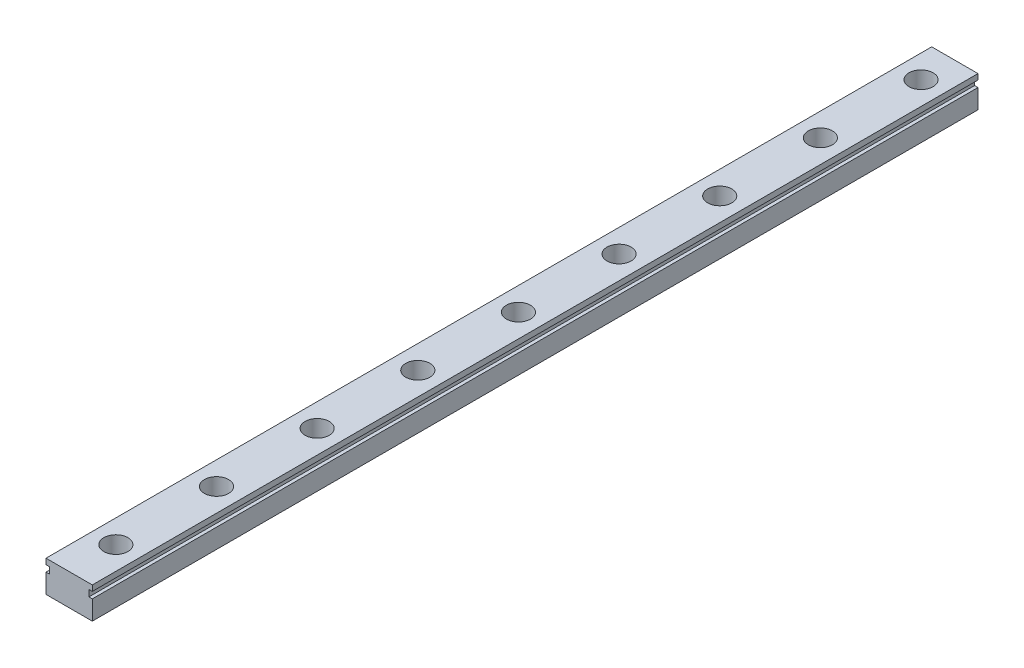
ISO-10303-21;
HEADER;
FILE_DESCRIPTION(('STEP AP214'),'2;1');
FILE_NAME('part.step','',(''),(''),'','','');
FILE_SCHEMA(('AUTOMOTIVE_DESIGN { 1 0 10303 214 1 1 1 1 }'));
ENDSEC;
DATA;
#1=APPLICATION_CONTEXT('core data for automotive mechanical design processes');
#2=APPLICATION_PROTOCOL_DEFINITION('international standard','automotive_design',2000,#1);
#3=PRODUCT_CONTEXT('',#1,'mechanical');
#4=PRODUCT('Part','Part','',(#3));
#5=PRODUCT_RELATED_PRODUCT_CATEGORY('part','',(#4));
#6=PRODUCT_DEFINITION_FORMATION('','',#4);
#7=PRODUCT_DEFINITION_CONTEXT('part definition',#1,'design');
#8=PRODUCT_DEFINITION('design','',#6,#7);
#9=PRODUCT_DEFINITION_SHAPE('','',#8);
#10=(LENGTH_UNIT() NAMED_UNIT(*) SI_UNIT(.MILLI.,.METRE.));
#11=(NAMED_UNIT(*) PLANE_ANGLE_UNIT() SI_UNIT($,.RADIAN.));
#12=(NAMED_UNIT(*) SI_UNIT($,.STERADIAN.) SOLID_ANGLE_UNIT());
#13=UNCERTAINTY_MEASURE_WITH_UNIT(LENGTH_MEASURE(1.E-05),#10,'distance_accuracy_value','');
#14=(GEOMETRIC_REPRESENTATION_CONTEXT(3) GLOBAL_UNCERTAINTY_ASSIGNED_CONTEXT((#13)) GLOBAL_UNIT_ASSIGNED_CONTEXT((#10,
#11,#12)) REPRESENTATION_CONTEXT('',''));
#15=CARTESIAN_POINT('',(0.,0.,0.));
#16=DIRECTION('',(0.,0.,1.));
#17=DIRECTION('',(1.,0.,0.));
#18=AXIS2_PLACEMENT_3D('',#15,#16,#17);
#19=CARTESIAN_POINT('',(5.75,-3.9,220.));
#20=DIRECTION('',(-1.,0.,0.));
#21=DIRECTION('',(0.,0.,1.));
#22=AXIS2_PLACEMENT_3D('',#19,#20,#21);
#23=PLANE('',#22);
#24=DIRECTION('',(0.,1.,0.));
#25=VECTOR('',#24,1.);
#26=CARTESIAN_POINT('',(5.75,-3.9,0.));
#27=LINE('',#26,#25);
#28=CARTESIAN_POINT('',(5.75,-3.9,0.));
#29=VERTEX_POINT('',#28);
#30=CARTESIAN_POINT('',(5.75,0.900000000000001,0.));
#31=VERTEX_POINT('',#30);
#32=EDGE_CURVE('E148',#29,#31,#27,.T.);
#33=ORIENTED_EDGE('',*,*,#32,.T.);
#34=DIRECTION('',(0.,0.,1.));
#35=VECTOR('',#34,1.);
#36=CARTESIAN_POINT('',(5.75,0.900000000000001,0.));
#37=LINE('',#36,#35);
#38=CARTESIAN_POINT('',(5.75,0.900000000000001,220.));
#39=VERTEX_POINT('',#38);
#40=EDGE_CURVE('E149',#31,#39,#37,.T.);
#41=ORIENTED_EDGE('',*,*,#40,.T.);
#42=DIRECTION('',(0.,1.,0.));
#43=VECTOR('',#42,1.);
#44=CARTESIAN_POINT('',(5.75,-3.9,220.));
#45=LINE('',#44,#43);
#46=CARTESIAN_POINT('',(5.75,-3.9,220.));
#47=VERTEX_POINT('',#46);
#48=EDGE_CURVE('E198',#47,#39,#45,.T.);
#49=ORIENTED_EDGE('',*,*,#48,.F.);
#50=DIRECTION('',(0.,0.,-1.));
#51=VECTOR('',#50,1.);
#52=CARTESIAN_POINT('',(5.75,-3.9,220.));
#53=LINE('',#52,#51);
#54=EDGE_CURVE('E166',#47,#29,#53,.T.);
#55=ORIENTED_EDGE('',*,*,#54,.T.);
#56=EDGE_LOOP('',(#33,#41,#49,#55));
#57=FACE_BOUND('',#56,.T.);
#58=ADVANCED_FACE('F37',(#57),#23,.F.);
#59=CARTESIAN_POINT('',(-5.75,-3.9,220.));
#60=DIRECTION('',(1.,0.,0.));
#61=DIRECTION('',(0.,0.,-1.));
#62=AXIS2_PLACEMENT_3D('',#59,#60,#61);
#63=PLANE('',#62);
#64=DIRECTION('',(0.,-1.,0.));
#65=VECTOR('',#64,1.);
#66=CARTESIAN_POINT('',(-5.75,-3.9,0.));
#67=LINE('',#66,#65);
#68=CARTESIAN_POINT('',(-5.75,3.9,0.));
#69=VERTEX_POINT('',#68);
#70=CARTESIAN_POINT('',(-5.75,2.5,0.));
#71=VERTEX_POINT('',#70);
#72=EDGE_CURVE('E161',#69,#71,#67,.T.);
#73=ORIENTED_EDGE('',*,*,#72,.T.);
#74=DIRECTION('',(0.,0.,1.));
#75=VECTOR('',#74,1.);
#76=CARTESIAN_POINT('',(-5.75,2.5,0.));
#77=LINE('',#76,#75);
#78=CARTESIAN_POINT('',(-5.75,2.5,220.));
#79=VERTEX_POINT('',#78);
#80=EDGE_CURVE('E238',#71,#79,#77,.T.);
#81=ORIENTED_EDGE('',*,*,#80,.T.);
#82=DIRECTION('',(0.,-1.,0.));
#83=VECTOR('',#82,1.);
#84=CARTESIAN_POINT('',(-5.75,-3.9,220.));
#85=LINE('',#84,#83);
#86=CARTESIAN_POINT('',(-5.75,3.9,220.));
#87=VERTEX_POINT('',#86);
#88=EDGE_CURVE('E178',#87,#79,#85,.T.);
#89=ORIENTED_EDGE('',*,*,#88,.F.);
#90=DIRECTION('',(0.,0.,-1.));
#91=VECTOR('',#90,1.);
#92=CARTESIAN_POINT('',(-5.75,3.9,220.));
#93=LINE('',#92,#91);
#94=EDGE_CURVE('E45',#87,#69,#93,.T.);
#95=ORIENTED_EDGE('',*,*,#94,.T.);
#96=EDGE_LOOP('',(#73,#81,#89,#95));
#97=FACE_BOUND('',#96,.T.);
#98=ADVANCED_FACE('F175',(#97),#63,.F.);
#99=CARTESIAN_POINT('',(5.75,2.5,220.));
#100=VERTEX_POINT('',#99);
#101=CARTESIAN_POINT('',(5.75,3.9,220.));
#102=VERTEX_POINT('',#101);
#103=EDGE_CURVE('E141',#100,#102,#45,.T.);
#104=ORIENTED_EDGE('',*,*,#103,.F.);
#105=DIRECTION('',(0.,0.,1.));
#106=VECTOR('',#105,1.);
#107=CARTESIAN_POINT('',(5.75,2.5,0.));
#108=LINE('',#107,#106);
#109=CARTESIAN_POINT('',(5.75,2.5,0.));
#110=VERTEX_POINT('',#109);
#111=EDGE_CURVE('E129',#110,#100,#108,.T.);
#112=ORIENTED_EDGE('',*,*,#111,.F.);
#113=CARTESIAN_POINT('',(5.75,3.9,0.));
#114=VERTEX_POINT('',#113);
#115=EDGE_CURVE('E139',#110,#114,#27,.T.);
#116=ORIENTED_EDGE('',*,*,#115,.T.);
#117=DIRECTION('',(0.,0.,-1.));
#118=VECTOR('',#117,1.);
#119=CARTESIAN_POINT('',(5.75,3.9,220.));
#120=LINE('',#119,#118);
#121=EDGE_CURVE('E11',#102,#114,#120,.T.);
#122=ORIENTED_EDGE('',*,*,#121,.F.);
#123=EDGE_LOOP('',(#104,#112,#116,#122));
#124=FACE_BOUND('',#123,.T.);
#125=ADVANCED_FACE('F39',(#124),#23,.F.);
#126=CARTESIAN_POINT('',(-5.75,3.9,220.));
#127=DIRECTION('',(0.,-1.,0.));
#128=DIRECTION('',(0.,0.,-1.));
#129=AXIS2_PLACEMENT_3D('',#126,#127,#128);
#130=PLANE('',#129);
#131=CARTESIAN_POINT('',(0.,3.9,208.4));
#132=DIRECTION('',(0.,1.,0.));
#133=DIRECTION('',(0.,0.,1.));
#134=AXIS2_PLACEMENT_3D('',#131,#132,#133);
#135=CIRCLE('',#134,3.);
#136=CARTESIAN_POINT('',(0.,3.9,211.4));
#137=VERTEX_POINT('',#136);
#138=EDGE_CURVE('E296',#137,#137,#135,.T.);
#139=ORIENTED_EDGE('',*,*,#138,.F.);
#140=EDGE_LOOP('',(#139));
#141=FACE_BOUND('',#140,.T.);
#142=CARTESIAN_POINT('',(0.,3.9,183.4));
#143=DIRECTION('',(0.,1.,0.));
#144=DIRECTION('',(0.,0.,1.));
#145=AXIS2_PLACEMENT_3D('',#142,#143,#144);
#146=CIRCLE('',#145,3.);
#147=CARTESIAN_POINT('',(0.,3.9,186.4));
#148=VERTEX_POINT('',#147);
#149=EDGE_CURVE('E293',#148,#148,#146,.T.);
#150=ORIENTED_EDGE('',*,*,#149,.F.);
#151=EDGE_LOOP('',(#150));
#152=FACE_BOUND('',#151,.T.);
#153=CARTESIAN_POINT('',(0.,3.9,158.4));
#154=DIRECTION('',(0.,1.,0.));
#155=DIRECTION('',(0.,0.,1.));
#156=AXIS2_PLACEMENT_3D('',#153,#154,#155);
#157=CIRCLE('',#156,3.);
#158=CARTESIAN_POINT('',(0.,3.9,161.4));
#159=VERTEX_POINT('',#158);
#160=EDGE_CURVE('E287',#159,#159,#157,.T.);
#161=ORIENTED_EDGE('',*,*,#160,.F.);
#162=EDGE_LOOP('',(#161));
#163=FACE_BOUND('',#162,.T.);
#164=CARTESIAN_POINT('',(0.,3.9,133.4));
#165=DIRECTION('',(0.,1.,0.));
#166=DIRECTION('',(0.,0.,1.));
#167=AXIS2_PLACEMENT_3D('',#164,#165,#166);
#168=CIRCLE('',#167,3.);
#169=CARTESIAN_POINT('',(0.,3.9,136.4));
#170=VERTEX_POINT('',#169);
#171=EDGE_CURVE('E281',#170,#170,#168,.T.);
#172=ORIENTED_EDGE('',*,*,#171,.F.);
#173=EDGE_LOOP('',(#172));
#174=FACE_BOUND('',#173,.T.);
#175=CARTESIAN_POINT('',(0.,3.9,108.4));
#176=DIRECTION('',(0.,1.,0.));
#177=DIRECTION('',(0.,0.,1.));
#178=AXIS2_PLACEMENT_3D('',#175,#176,#177);
#179=CIRCLE('',#178,3.);
#180=CARTESIAN_POINT('',(0.,3.9,111.4));
#181=VERTEX_POINT('',#180);
#182=EDGE_CURVE('E275',#181,#181,#179,.T.);
#183=ORIENTED_EDGE('',*,*,#182,.F.);
#184=EDGE_LOOP('',(#183));
#185=FACE_BOUND('',#184,.T.);
#186=CARTESIAN_POINT('',(0.,3.9,83.4));
#187=DIRECTION('',(0.,1.,0.));
#188=DIRECTION('',(0.,0.,1.));
#189=AXIS2_PLACEMENT_3D('',#186,#187,#188);
#190=CIRCLE('',#189,3.);
#191=CARTESIAN_POINT('',(0.,3.9,86.4));
#192=VERTEX_POINT('',#191);
#193=EDGE_CURVE('E269',#192,#192,#190,.T.);
#194=ORIENTED_EDGE('',*,*,#193,.F.);
#195=EDGE_LOOP('',(#194));
#196=FACE_BOUND('',#195,.T.);
#197=CARTESIAN_POINT('',(0.,3.9,58.4000000000001));
#198=DIRECTION('',(0.,1.,0.));
#199=DIRECTION('',(0.,0.,1.));
#200=AXIS2_PLACEMENT_3D('',#197,#198,#199);
#201=CIRCLE('',#200,3.);
#202=CARTESIAN_POINT('',(0.,3.9,61.4000000000001));
#203=VERTEX_POINT('',#202);
#204=EDGE_CURVE('E263',#203,#203,#201,.T.);
#205=ORIENTED_EDGE('',*,*,#204,.F.);
#206=EDGE_LOOP('',(#205));
#207=FACE_BOUND('',#206,.T.);
#208=CARTESIAN_POINT('',(0.,3.9,33.4000000000001));
#209=DIRECTION('',(0.,1.,0.));
#210=DIRECTION('',(0.,0.,1.));
#211=AXIS2_PLACEMENT_3D('',#208,#209,#210);
#212=CIRCLE('',#211,3.);
#213=CARTESIAN_POINT('',(0.,3.9,36.4000000000001));
#214=VERTEX_POINT('',#213);
#215=EDGE_CURVE('E257',#214,#214,#212,.T.);
#216=ORIENTED_EDGE('',*,*,#215,.F.);
#217=EDGE_LOOP('',(#216));
#218=FACE_BOUND('',#217,.T.);
#219=CARTESIAN_POINT('',(0.,3.9,8.40000000000007));
#220=DIRECTION('',(0.,1.,0.));
#221=DIRECTION('',(0.,0.,1.));
#222=AXIS2_PLACEMENT_3D('',#219,#220,#221);
#223=CIRCLE('',#222,3.);
#224=CARTESIAN_POINT('',(0.,3.9,11.4000000000001));
#225=VERTEX_POINT('',#224);
#226=EDGE_CURVE('E250',#225,#225,#223,.T.);
#227=ORIENTED_EDGE('',*,*,#226,.F.);
#228=EDGE_LOOP('',(#227));
#229=FACE_BOUND('',#228,.T.);
#230=DIRECTION('',(-1.,0.,0.));
#231=VECTOR('',#230,1.);
#232=CARTESIAN_POINT('',(-5.75,3.9,0.));
#233=LINE('',#232,#231);
#234=EDGE_CURVE('E147',#114,#69,#233,.T.);
#235=ORIENTED_EDGE('',*,*,#234,.T.);
#236=ORIENTED_EDGE('',*,*,#94,.F.);
#237=DIRECTION('',(-1.,0.,0.));
#238=VECTOR('',#237,1.);
#239=CARTESIAN_POINT('',(-5.75,3.9,220.));
#240=LINE('',#239,#238);
#241=EDGE_CURVE('E201',#102,#87,#240,.T.);
#242=ORIENTED_EDGE('',*,*,#241,.F.);
#243=ORIENTED_EDGE('',*,*,#121,.T.);
#244=EDGE_LOOP('',(#235,#236,#242,#243));
#245=FACE_BOUND('',#244,.T.);
#246=ADVANCED_FACE('F378',(#141,#152,#163,#174,#185,#196,#207,#218,#229,#245),#130,.F.);
#247=CARTESIAN_POINT('',(-5.75,0.900000000000001,220.));
#248=VERTEX_POINT('',#247);
#249=CARTESIAN_POINT('',(-5.75,-3.9,220.));
#250=VERTEX_POINT('',#249);
#251=EDGE_CURVE('E202',#248,#250,#85,.T.);
#252=ORIENTED_EDGE('',*,*,#251,.F.);
#253=DIRECTION('',(0.,0.,1.));
#254=VECTOR('',#253,1.);
#255=CARTESIAN_POINT('',(-5.75,0.900000000000001,0.));
#256=LINE('',#255,#254);
#257=CARTESIAN_POINT('',(-5.75,0.900000000000001,0.));
#258=VERTEX_POINT('',#257);
#259=EDGE_CURVE('E186',#258,#248,#256,.T.);
#260=ORIENTED_EDGE('',*,*,#259,.F.);
#261=CARTESIAN_POINT('',(-5.75,-3.9,0.));
#262=VERTEX_POINT('',#261);
#263=EDGE_CURVE('E160',#258,#262,#67,.T.);
#264=ORIENTED_EDGE('',*,*,#263,.T.);
#265=DIRECTION('',(0.,0.,-1.));
#266=VECTOR('',#265,1.);
#267=CARTESIAN_POINT('',(-5.75,-3.9,220.));
#268=LINE('',#267,#266);
#269=EDGE_CURVE('E169',#250,#262,#268,.T.);
#270=ORIENTED_EDGE('',*,*,#269,.F.);
#271=EDGE_LOOP('',(#252,#260,#264,#270));
#272=FACE_BOUND('',#271,.T.);
#273=ADVANCED_FACE('F215',(#272),#63,.F.);
#274=CARTESIAN_POINT('',(-5.75,-3.9,220.));
#275=DIRECTION('',(0.,1.,0.));
#276=DIRECTION('',(0.,0.,1.));
#277=AXIS2_PLACEMENT_3D('',#274,#275,#276);
#278=PLANE('',#277);
#279=CARTESIAN_POINT('',(0.,-3.9,208.4));
#280=DIRECTION('',(0.,1.,0.));
#281=DIRECTION('',(0.,0.,1.));
#282=AXIS2_PLACEMENT_3D('',#279,#280,#281);
#283=CIRCLE('',#282,1.7);
#284=CARTESIAN_POINT('',(0.,-3.9,210.1));
#285=VERTEX_POINT('',#284);
#286=EDGE_CURVE('E251',#285,#285,#283,.T.);
#287=ORIENTED_EDGE('',*,*,#286,.T.);
#288=EDGE_LOOP('',(#287));
#289=FACE_BOUND('',#288,.T.);
#290=CARTESIAN_POINT('',(0.,-3.9,183.4));
#291=DIRECTION('',(0.,1.,0.));
#292=DIRECTION('',(0.,0.,1.));
#293=AXIS2_PLACEMENT_3D('',#290,#291,#292);
#294=CIRCLE('',#293,1.7);
#295=CARTESIAN_POINT('',(0.,-3.9,185.1));
#296=VERTEX_POINT('',#295);
#297=EDGE_CURVE('E343',#296,#296,#294,.T.);
#298=ORIENTED_EDGE('',*,*,#297,.T.);
#299=EDGE_LOOP('',(#298));
#300=FACE_BOUND('',#299,.T.);
#301=CARTESIAN_POINT('',(0.,-3.9,158.4));
#302=DIRECTION('',(0.,1.,0.));
#303=DIRECTION('',(0.,0.,1.));
#304=AXIS2_PLACEMENT_3D('',#301,#302,#303);
#305=CIRCLE('',#304,1.7);
#306=CARTESIAN_POINT('',(0.,-3.9,160.1));
#307=VERTEX_POINT('',#306);
#308=EDGE_CURVE('E337',#307,#307,#305,.T.);
#309=ORIENTED_EDGE('',*,*,#308,.T.);
#310=EDGE_LOOP('',(#309));
#311=FACE_BOUND('',#310,.T.);
#312=CARTESIAN_POINT('',(0.,-3.9,133.4));
#313=DIRECTION('',(0.,1.,0.));
#314=DIRECTION('',(0.,0.,1.));
#315=AXIS2_PLACEMENT_3D('',#312,#313,#314);
#316=CIRCLE('',#315,1.70000000000001);
#317=CARTESIAN_POINT('',(0.,-3.9,135.1));
#318=VERTEX_POINT('',#317);
#319=EDGE_CURVE('E331',#318,#318,#316,.T.);
#320=ORIENTED_EDGE('',*,*,#319,.T.);
#321=EDGE_LOOP('',(#320));
#322=FACE_BOUND('',#321,.T.);
#323=CARTESIAN_POINT('',(0.,-3.9,108.4));
#324=DIRECTION('',(0.,1.,0.));
#325=DIRECTION('',(0.,0.,1.));
#326=AXIS2_PLACEMENT_3D('',#323,#324,#325);
#327=CIRCLE('',#326,1.70000000000001);
#328=CARTESIAN_POINT('',(0.,-3.9,110.1));
#329=VERTEX_POINT('',#328);
#330=EDGE_CURVE('E325',#329,#329,#327,.T.);
#331=ORIENTED_EDGE('',*,*,#330,.T.);
#332=EDGE_LOOP('',(#331));
#333=FACE_BOUND('',#332,.T.);
#334=CARTESIAN_POINT('',(0.,-3.9,83.4));
#335=DIRECTION('',(0.,1.,0.));
#336=DIRECTION('',(0.,0.,1.));
#337=AXIS2_PLACEMENT_3D('',#334,#335,#336);
#338=CIRCLE('',#337,1.70000000000001);
#339=CARTESIAN_POINT('',(0.,-3.9,85.1));
#340=VERTEX_POINT('',#339);
#341=EDGE_CURVE('E319',#340,#340,#338,.T.);
#342=ORIENTED_EDGE('',*,*,#341,.T.);
#343=EDGE_LOOP('',(#342));
#344=FACE_BOUND('',#343,.T.);
#345=CARTESIAN_POINT('',(0.,-3.9,58.4));
#346=DIRECTION('',(0.,1.,0.));
#347=DIRECTION('',(0.,0.,1.));
#348=AXIS2_PLACEMENT_3D('',#345,#346,#347);
#349=CIRCLE('',#348,1.7);
#350=CARTESIAN_POINT('',(0.,-3.9,60.1));
#351=VERTEX_POINT('',#350);
#352=EDGE_CURVE('E313',#351,#351,#349,.T.);
#353=ORIENTED_EDGE('',*,*,#352,.T.);
#354=EDGE_LOOP('',(#353));
#355=FACE_BOUND('',#354,.T.);
#356=CARTESIAN_POINT('',(0.,-3.9,33.4));
#357=DIRECTION('',(0.,1.,0.));
#358=DIRECTION('',(0.,0.,1.));
#359=AXIS2_PLACEMENT_3D('',#356,#357,#358);
#360=CIRCLE('',#359,1.7);
#361=CARTESIAN_POINT('',(0.,-3.9,35.1));
#362=VERTEX_POINT('',#361);
#363=EDGE_CURVE('E307',#362,#362,#360,.T.);
#364=ORIENTED_EDGE('',*,*,#363,.T.);
#365=EDGE_LOOP('',(#364));
#366=FACE_BOUND('',#365,.T.);
#367=CARTESIAN_POINT('',(0.,-3.9,8.40000000000005));
#368=DIRECTION('',(0.,1.,0.));
#369=DIRECTION('',(0.,0.,1.));
#370=AXIS2_PLACEMENT_3D('',#367,#368,#369);
#371=CIRCLE('',#370,1.7);
#372=CARTESIAN_POINT('',(0.,-3.9,10.1));
#373=VERTEX_POINT('',#372);
#374=EDGE_CURVE('E301',#373,#373,#371,.T.);
#375=ORIENTED_EDGE('',*,*,#374,.T.);
#376=EDGE_LOOP('',(#375));
#377=FACE_BOUND('',#376,.T.);
#378=DIRECTION('',(1.,0.,0.));
#379=VECTOR('',#378,1.);
#380=CARTESIAN_POINT('',(-5.75,-3.9,0.));
#381=LINE('',#380,#379);
#382=EDGE_CURVE('E164',#262,#29,#381,.T.);
#383=ORIENTED_EDGE('',*,*,#382,.T.);
#384=ORIENTED_EDGE('',*,*,#54,.F.);
#385=DIRECTION('',(1.,0.,0.));
#386=VECTOR('',#385,1.);
#387=CARTESIAN_POINT('',(-5.75,-3.9,220.));
#388=LINE('',#387,#386);
#389=EDGE_CURVE('E157',#250,#47,#388,.T.);
#390=ORIENTED_EDGE('',*,*,#389,.F.);
#391=ORIENTED_EDGE('',*,*,#269,.T.);
#392=EDGE_LOOP('',(#383,#384,#390,#391));
#393=FACE_BOUND('',#392,.T.);
#394=ADVANCED_FACE('F219',(#289,#300,#311,#322,#333,#344,#355,#366,#377,#393),#278,.F.);
#395=CARTESIAN_POINT('',(0.,0.,220.));
#396=DIRECTION('',(0.,0.,-1.));
#397=DIRECTION('',(-1.,0.,0.));
#398=AXIS2_PLACEMENT_3D('',#395,#396,#397);
#399=PLANE('',#398);
#400=ORIENTED_EDGE('',*,*,#48,.T.);
#401=DIRECTION('',(1.,0.,0.));
#402=VECTOR('',#401,1.);
#403=CARTESIAN_POINT('',(5.75,0.900000000000001,220.));
#404=LINE('',#403,#402);
#405=CARTESIAN_POINT('',(4.91474977144023,0.900000000000001,220.));
#406=VERTEX_POINT('',#405);
#407=EDGE_CURVE('E134',#406,#39,#404,.T.);
#408=ORIENTED_EDGE('',*,*,#407,.F.);
#409=DIRECTION('',(0.,-1.,0.));
#410=VECTOR('',#409,1.);
#411=CARTESIAN_POINT('',(4.91474977144023,2.5,220.));
#412=LINE('',#411,#410);
#413=CARTESIAN_POINT('',(4.91474977144023,2.5,220.));
#414=VERTEX_POINT('',#413);
#415=EDGE_CURVE('E226',#414,#406,#412,.T.);
#416=ORIENTED_EDGE('',*,*,#415,.F.);
#417=DIRECTION('',(-1.,0.,0.));
#418=VECTOR('',#417,1.);
#419=CARTESIAN_POINT('',(5.75,2.5,220.));
#420=LINE('',#419,#418);
#421=EDGE_CURVE('E229',#100,#414,#420,.T.);
#422=ORIENTED_EDGE('',*,*,#421,.F.);
#423=ORIENTED_EDGE('',*,*,#103,.T.);
#424=ORIENTED_EDGE('',*,*,#241,.T.);
#425=ORIENTED_EDGE('',*,*,#88,.T.);
#426=DIRECTION('',(-1.,0.,0.));
#427=VECTOR('',#426,1.);
#428=CARTESIAN_POINT('',(-5.75,2.5,220.));
#429=LINE('',#428,#427);
#430=CARTESIAN_POINT('',(-4.91474977144023,2.5,220.));
#431=VERTEX_POINT('',#430);
#432=EDGE_CURVE('E197',#431,#79,#429,.T.);
#433=ORIENTED_EDGE('',*,*,#432,.F.);
#434=DIRECTION('',(0.,1.,0.));
#435=VECTOR('',#434,1.);
#436=CARTESIAN_POINT('',(-4.91474977144023,2.5,220.));
#437=LINE('',#436,#435);
#438=CARTESIAN_POINT('',(-4.91474977144023,0.900000000000001,220.));
#439=VERTEX_POINT('',#438);
#440=EDGE_CURVE('E241',#439,#431,#437,.T.);
#441=ORIENTED_EDGE('',*,*,#440,.F.);
#442=DIRECTION('',(1.,0.,0.));
#443=VECTOR('',#442,1.);
#444=CARTESIAN_POINT('',(-5.75,0.900000000000001,220.));
#445=LINE('',#444,#443);
#446=EDGE_CURVE('E193',#248,#439,#445,.T.);
#447=ORIENTED_EDGE('',*,*,#446,.F.);
#448=ORIENTED_EDGE('',*,*,#251,.T.);
#449=ORIENTED_EDGE('',*,*,#389,.T.);
#450=EDGE_LOOP('',(#400,#408,#416,#422,#423,#424,#425,#433,#441,#447,#448,#449));
#451=FACE_BOUND('',#450,.T.);
#452=ADVANCED_FACE('F208',(#451),#399,.F.);
#453=CARTESIAN_POINT('',(0.,0.,0.));
#454=DIRECTION('',(0.,0.,-1.));
#455=DIRECTION('',(-1.,0.,0.));
#456=AXIS2_PLACEMENT_3D('',#453,#454,#455);
#457=PLANE('',#456);
#458=DIRECTION('',(1.,0.,0.));
#459=VECTOR('',#458,1.);
#460=CARTESIAN_POINT('',(5.75,0.900000000000001,0.));
#461=LINE('',#460,#459);
#462=CARTESIAN_POINT('',(4.91474977144023,0.900000000000001,0.));
#463=VERTEX_POINT('',#462);
#464=EDGE_CURVE('E142',#463,#31,#461,.T.);
#465=ORIENTED_EDGE('',*,*,#464,.T.);
#466=ORIENTED_EDGE('',*,*,#32,.F.);
#467=ORIENTED_EDGE('',*,*,#382,.F.);
#468=ORIENTED_EDGE('',*,*,#263,.F.);
#469=DIRECTION('',(1.,0.,0.));
#470=VECTOR('',#469,1.);
#471=CARTESIAN_POINT('',(-5.75,0.900000000000001,0.));
#472=LINE('',#471,#470);
#473=CARTESIAN_POINT('',(-4.91474977144023,0.900000000000001,0.));
#474=VERTEX_POINT('',#473);
#475=EDGE_CURVE('E188',#258,#474,#472,.T.);
#476=ORIENTED_EDGE('',*,*,#475,.T.);
#477=DIRECTION('',(0.,1.,0.));
#478=VECTOR('',#477,1.);
#479=CARTESIAN_POINT('',(-4.91474977144023,2.5,0.));
#480=LINE('',#479,#478);
#481=CARTESIAN_POINT('',(-4.91474977144023,2.5,0.));
#482=VERTEX_POINT('',#481);
#483=EDGE_CURVE('E60',#474,#482,#480,.T.);
#484=ORIENTED_EDGE('',*,*,#483,.T.);
#485=DIRECTION('',(-1.,0.,0.));
#486=VECTOR('',#485,1.);
#487=CARTESIAN_POINT('',(-5.75,2.5,0.));
#488=LINE('',#487,#486);
#489=EDGE_CURVE('E183',#482,#71,#488,.T.);
#490=ORIENTED_EDGE('',*,*,#489,.T.);
#491=ORIENTED_EDGE('',*,*,#72,.F.);
#492=ORIENTED_EDGE('',*,*,#234,.F.);
#493=ORIENTED_EDGE('',*,*,#115,.F.);
#494=DIRECTION('',(-1.,0.,0.));
#495=VECTOR('',#494,1.);
#496=CARTESIAN_POINT('',(5.75,2.5,0.));
#497=LINE('',#496,#495);
#498=CARTESIAN_POINT('',(4.91474977144023,2.5,0.));
#499=VERTEX_POINT('',#498);
#500=EDGE_CURVE('E125',#110,#499,#497,.T.);
#501=ORIENTED_EDGE('',*,*,#500,.T.);
#502=DIRECTION('',(0.,-1.,0.));
#503=VECTOR('',#502,1.);
#504=CARTESIAN_POINT('',(4.91474977144023,2.5,0.));
#505=LINE('',#504,#503);
#506=EDGE_CURVE('E52',#499,#463,#505,.T.);
#507=ORIENTED_EDGE('',*,*,#506,.T.);
#508=EDGE_LOOP('',(#465,#466,#467,#468,#476,#484,#490,#491,#492,#493,#501,#507));
#509=FACE_BOUND('',#508,.T.);
#510=ADVANCED_FACE('F145',(#509),#457,.T.);
#511=CARTESIAN_POINT('',(-5.75,2.5,0.));
#512=DIRECTION('',(0.,1.,0.));
#513=DIRECTION('',(0.,0.,1.));
#514=AXIS2_PLACEMENT_3D('',#511,#512,#513);
#515=PLANE('',#514);
#516=ORIENTED_EDGE('',*,*,#432,.T.);
#517=ORIENTED_EDGE('',*,*,#80,.F.);
#518=ORIENTED_EDGE('',*,*,#489,.F.);
#519=DIRECTION('',(0.,0.,1.));
#520=VECTOR('',#519,1.);
#521=CARTESIAN_POINT('',(-4.91474977144023,2.5,0.));
#522=LINE('',#521,#520);
#523=EDGE_CURVE('E236',#482,#431,#522,.T.);
#524=ORIENTED_EDGE('',*,*,#523,.T.);
#525=EDGE_LOOP('',(#516,#517,#518,#524));
#526=FACE_BOUND('',#525,.T.);
#527=ADVANCED_FACE('F453',(#526),#515,.F.);
#528=CARTESIAN_POINT('',(-4.91474977144023,2.5,0.));
#529=DIRECTION('',(1.,0.,0.));
#530=DIRECTION('',(0.,0.,-1.));
#531=AXIS2_PLACEMENT_3D('',#528,#529,#530);
#532=PLANE('',#531);
#533=ORIENTED_EDGE('',*,*,#440,.T.);
#534=ORIENTED_EDGE('',*,*,#523,.F.);
#535=ORIENTED_EDGE('',*,*,#483,.F.);
#536=DIRECTION('',(0.,0.,1.));
#537=VECTOR('',#536,1.);
#538=CARTESIAN_POINT('',(-4.91474977144023,0.900000000000001,0.));
#539=LINE('',#538,#537);
#540=EDGE_CURVE('E190',#474,#439,#539,.T.);
#541=ORIENTED_EDGE('',*,*,#540,.T.);
#542=EDGE_LOOP('',(#533,#534,#535,#541));
#543=FACE_BOUND('',#542,.T.);
#544=ADVANCED_FACE('F460',(#543),#532,.F.);
#545=CARTESIAN_POINT('',(-5.75,0.900000000000001,0.));
#546=DIRECTION('',(0.,-1.,0.));
#547=DIRECTION('',(0.,0.,-1.));
#548=AXIS2_PLACEMENT_3D('',#545,#546,#547);
#549=PLANE('',#548);
#550=ORIENTED_EDGE('',*,*,#446,.T.);
#551=ORIENTED_EDGE('',*,*,#540,.F.);
#552=ORIENTED_EDGE('',*,*,#475,.F.);
#553=ORIENTED_EDGE('',*,*,#259,.T.);
#554=EDGE_LOOP('',(#550,#551,#552,#553));
#555=FACE_BOUND('',#554,.T.);
#556=ADVANCED_FACE('F467',(#555),#549,.F.);
#557=CARTESIAN_POINT('',(5.75,0.900000000000001,0.));
#558=DIRECTION('',(0.,-1.,0.));
#559=DIRECTION('',(0.,0.,-1.));
#560=AXIS2_PLACEMENT_3D('',#557,#558,#559);
#561=PLANE('',#560);
#562=ORIENTED_EDGE('',*,*,#407,.T.);
#563=ORIENTED_EDGE('',*,*,#40,.F.);
#564=ORIENTED_EDGE('',*,*,#464,.F.);
#565=DIRECTION('',(0.,0.,1.));
#566=VECTOR('',#565,1.);
#567=CARTESIAN_POINT('',(4.91474977144023,0.900000000000001,0.));
#568=LINE('',#567,#566);
#569=EDGE_CURVE('E153',#463,#406,#568,.T.);
#570=ORIENTED_EDGE('',*,*,#569,.T.);
#571=EDGE_LOOP('',(#562,#563,#564,#570));
#572=FACE_BOUND('',#571,.T.);
#573=ADVANCED_FACE('F474',(#572),#561,.F.);
#574=CARTESIAN_POINT('',(4.91474977144023,2.5,0.));
#575=DIRECTION('',(-1.,0.,0.));
#576=DIRECTION('',(0.,0.,1.));
#577=AXIS2_PLACEMENT_3D('',#574,#575,#576);
#578=PLANE('',#577);
#579=ORIENTED_EDGE('',*,*,#415,.T.);
#580=ORIENTED_EDGE('',*,*,#569,.F.);
#581=ORIENTED_EDGE('',*,*,#506,.F.);
#582=DIRECTION('',(0.,0.,1.));
#583=VECTOR('',#582,1.);
#584=CARTESIAN_POINT('',(4.91474977144023,2.5,0.));
#585=LINE('',#584,#583);
#586=EDGE_CURVE('E131',#499,#414,#585,.T.);
#587=ORIENTED_EDGE('',*,*,#586,.T.);
#588=EDGE_LOOP('',(#579,#580,#581,#587));
#589=FACE_BOUND('',#588,.T.);
#590=ADVANCED_FACE('F409',(#589),#578,.F.);
#591=CARTESIAN_POINT('',(5.75,2.5,0.));
#592=DIRECTION('',(0.,1.,0.));
#593=DIRECTION('',(0.,0.,1.));
#594=AXIS2_PLACEMENT_3D('',#591,#592,#593);
#595=PLANE('',#594);
#596=ORIENTED_EDGE('',*,*,#421,.T.);
#597=ORIENTED_EDGE('',*,*,#586,.F.);
#598=ORIENTED_EDGE('',*,*,#500,.F.);
#599=ORIENTED_EDGE('',*,*,#111,.T.);
#600=EDGE_LOOP('',(#596,#597,#598,#599));
#601=FACE_BOUND('',#600,.T.);
#602=ADVANCED_FACE('F128',(#601),#595,.F.);
#603=CARTESIAN_POINT('',(0.,-0.799999999999999,8.40000000000007));
#604=DIRECTION('',(0.,1.,0.));
#605=DIRECTION('',(0.,0.,1.));
#606=AXIS2_PLACEMENT_3D('',#603,#604,#605);
#607=CYLINDRICAL_SURFACE('',#606,3.);
#608=CARTESIAN_POINT('',(0.,-0.799999999999999,8.40000000000007));
#609=DIRECTION('',(0.,1.,0.));
#610=DIRECTION('',(0.,0.,1.));
#611=AXIS2_PLACEMENT_3D('',#608,#609,#610);
#612=CIRCLE('',#611,3.);
#613=CARTESIAN_POINT('',(0.,-0.799999999999999,11.4000000000001));
#614=VERTEX_POINT('',#613);
#615=EDGE_CURVE('E247',#614,#614,#612,.T.);
#616=ORIENTED_EDGE('',*,*,#615,.F.);
#617=EDGE_LOOP('',(#616));
#618=FACE_BOUND('',#617,.T.);
#619=ORIENTED_EDGE('',*,*,#226,.T.);
#620=EDGE_LOOP('',(#619));
#621=FACE_BOUND('',#620,.T.);
#622=ADVANCED_FACE('F397',(#618,#621),#607,.F.);
#623=CARTESIAN_POINT('',(0.,-0.799999999999999,8.40000000000007));
#624=DIRECTION('',(0.,1.,0.));
#625=DIRECTION('',(0.,0.,1.));
#626=AXIS2_PLACEMENT_3D('',#623,#624,#625);
#627=PLANE('',#626);
#628=CARTESIAN_POINT('',(0.,-0.799999999999999,8.40000000000005));
#629=DIRECTION('',(0.,1.,0.));
#630=DIRECTION('',(0.,0.,1.));
#631=AXIS2_PLACEMENT_3D('',#628,#629,#630);
#632=CIRCLE('',#631,1.7);
#633=CARTESIAN_POINT('',(0.,-0.799999999999999,10.1));
#634=VERTEX_POINT('',#633);
#635=EDGE_CURVE('E304',#634,#634,#632,.T.);
#636=ORIENTED_EDGE('',*,*,#635,.F.);
#637=EDGE_LOOP('',(#636));
#638=FACE_BOUND('',#637,.T.);
#639=ORIENTED_EDGE('',*,*,#615,.T.);
#640=EDGE_LOOP('',(#639));
#641=FACE_BOUND('',#640,.T.);
#642=ADVANCED_FACE('F399',(#638,#641),#627,.T.);
#643=CARTESIAN_POINT('',(0.,-0.799999999999999,33.4000000000001));
#644=DIRECTION('',(0.,1.,0.));
#645=DIRECTION('',(0.,0.,1.));
#646=AXIS2_PLACEMENT_3D('',#643,#644,#645);
#647=CYLINDRICAL_SURFACE('',#646,3.);
#648=CARTESIAN_POINT('',(0.,-0.799999999999999,33.4000000000001));
#649=DIRECTION('',(0.,1.,0.));
#650=DIRECTION('',(0.,0.,1.));
#651=AXIS2_PLACEMENT_3D('',#648,#649,#650);
#652=CIRCLE('',#651,3.);
#653=CARTESIAN_POINT('',(0.,-0.799999999999999,36.4000000000001));
#654=VERTEX_POINT('',#653);
#655=EDGE_CURVE('E254',#654,#654,#652,.T.);
#656=ORIENTED_EDGE('',*,*,#655,.F.);
#657=EDGE_LOOP('',(#656));
#658=FACE_BOUND('',#657,.T.);
#659=ORIENTED_EDGE('',*,*,#215,.T.);
#660=EDGE_LOOP('',(#659));
#661=FACE_BOUND('',#660,.T.);
#662=ADVANCED_FACE('F406',(#658,#661),#647,.F.);
#663=CARTESIAN_POINT('',(0.,-0.799999999999999,33.4000000000001));
#664=DIRECTION('',(0.,1.,0.));
#665=DIRECTION('',(0.,0.,1.));
#666=AXIS2_PLACEMENT_3D('',#663,#664,#665);
#667=PLANE('',#666);
#668=CARTESIAN_POINT('',(0.,-0.799999999999999,33.4));
#669=DIRECTION('',(0.,1.,0.));
#670=DIRECTION('',(0.,0.,1.));
#671=AXIS2_PLACEMENT_3D('',#668,#669,#670);
#672=CIRCLE('',#671,1.7);
#673=CARTESIAN_POINT('',(0.,-0.799999999999999,35.1));
#674=VERTEX_POINT('',#673);
#675=EDGE_CURVE('E310',#674,#674,#672,.T.);
#676=ORIENTED_EDGE('',*,*,#675,.F.);
#677=EDGE_LOOP('',(#676));
#678=FACE_BOUND('',#677,.T.);
#679=ORIENTED_EDGE('',*,*,#655,.T.);
#680=EDGE_LOOP('',(#679));
#681=FACE_BOUND('',#680,.T.);
#682=ADVANCED_FACE('F519',(#678,#681),#667,.T.);
#683=CARTESIAN_POINT('',(0.,-0.799999999999999,58.4000000000001));
#684=DIRECTION('',(0.,1.,0.));
#685=DIRECTION('',(0.,0.,1.));
#686=AXIS2_PLACEMENT_3D('',#683,#684,#685);
#687=CYLINDRICAL_SURFACE('',#686,3.);
#688=CARTESIAN_POINT('',(0.,-0.799999999999999,58.4000000000001));
#689=DIRECTION('',(0.,1.,0.));
#690=DIRECTION('',(0.,0.,1.));
#691=AXIS2_PLACEMENT_3D('',#688,#689,#690);
#692=CIRCLE('',#691,3.);
#693=CARTESIAN_POINT('',(0.,-0.799999999999999,61.4000000000001));
#694=VERTEX_POINT('',#693);
#695=EDGE_CURVE('E260',#694,#694,#692,.T.);
#696=ORIENTED_EDGE('',*,*,#695,.F.);
#697=EDGE_LOOP('',(#696));
#698=FACE_BOUND('',#697,.T.);
#699=ORIENTED_EDGE('',*,*,#204,.T.);
#700=EDGE_LOOP('',(#699));
#701=FACE_BOUND('',#700,.T.);
#702=ADVANCED_FACE('F530',(#698,#701),#687,.F.);
#703=CARTESIAN_POINT('',(0.,-0.799999999999999,58.4000000000001));
#704=DIRECTION('',(0.,1.,0.));
#705=DIRECTION('',(0.,0.,1.));
#706=AXIS2_PLACEMENT_3D('',#703,#704,#705);
#707=PLANE('',#706);
#708=CARTESIAN_POINT('',(0.,-0.799999999999999,58.4));
#709=DIRECTION('',(0.,1.,0.));
#710=DIRECTION('',(0.,0.,1.));
#711=AXIS2_PLACEMENT_3D('',#708,#709,#710);
#712=CIRCLE('',#711,1.7);
#713=CARTESIAN_POINT('',(0.,-0.799999999999999,60.1));
#714=VERTEX_POINT('',#713);
#715=EDGE_CURVE('E316',#714,#714,#712,.T.);
#716=ORIENTED_EDGE('',*,*,#715,.F.);
#717=EDGE_LOOP('',(#716));
#718=FACE_BOUND('',#717,.T.);
#719=ORIENTED_EDGE('',*,*,#695,.T.);
#720=EDGE_LOOP('',(#719));
#721=FACE_BOUND('',#720,.T.);
#722=ADVANCED_FACE('F540',(#718,#721),#707,.T.);
#723=CARTESIAN_POINT('',(0.,-0.799999999999999,83.4));
#724=DIRECTION('',(0.,1.,0.));
#725=DIRECTION('',(0.,0.,1.));
#726=AXIS2_PLACEMENT_3D('',#723,#724,#725);
#727=CYLINDRICAL_SURFACE('',#726,3.);
#728=CARTESIAN_POINT('',(0.,-0.799999999999999,83.4));
#729=DIRECTION('',(0.,1.,0.));
#730=DIRECTION('',(0.,0.,1.));
#731=AXIS2_PLACEMENT_3D('',#728,#729,#730);
#732=CIRCLE('',#731,3.);
#733=CARTESIAN_POINT('',(0.,-0.799999999999999,86.4));
#734=VERTEX_POINT('',#733);
#735=EDGE_CURVE('E266',#734,#734,#732,.T.);
#736=ORIENTED_EDGE('',*,*,#735,.F.);
#737=EDGE_LOOP('',(#736));
#738=FACE_BOUND('',#737,.T.);
#739=ORIENTED_EDGE('',*,*,#193,.T.);
#740=EDGE_LOOP('',(#739));
#741=FACE_BOUND('',#740,.T.);
#742=ADVANCED_FACE('F551',(#738,#741),#727,.F.);
#743=CARTESIAN_POINT('',(0.,-0.799999999999999,83.4));
#744=DIRECTION('',(0.,1.,0.));
#745=DIRECTION('',(0.,0.,1.));
#746=AXIS2_PLACEMENT_3D('',#743,#744,#745);
#747=PLANE('',#746);
#748=CARTESIAN_POINT('',(0.,-0.799999999999999,83.4));
#749=DIRECTION('',(0.,1.,0.));
#750=DIRECTION('',(0.,0.,1.));
#751=AXIS2_PLACEMENT_3D('',#748,#749,#750);
#752=CIRCLE('',#751,1.70000000000001);
#753=CARTESIAN_POINT('',(0.,-0.799999999999999,85.1));
#754=VERTEX_POINT('',#753);
#755=EDGE_CURVE('E322',#754,#754,#752,.T.);
#756=ORIENTED_EDGE('',*,*,#755,.F.);
#757=EDGE_LOOP('',(#756));
#758=FACE_BOUND('',#757,.T.);
#759=ORIENTED_EDGE('',*,*,#735,.T.);
#760=EDGE_LOOP('',(#759));
#761=FACE_BOUND('',#760,.T.);
#762=ADVANCED_FACE('F562',(#758,#761),#747,.T.);
#763=CARTESIAN_POINT('',(0.,-0.799999999999999,108.4));
#764=DIRECTION('',(0.,1.,0.));
#765=DIRECTION('',(0.,0.,1.));
#766=AXIS2_PLACEMENT_3D('',#763,#764,#765);
#767=CYLINDRICAL_SURFACE('',#766,3.);
#768=CARTESIAN_POINT('',(0.,-0.799999999999999,108.4));
#769=DIRECTION('',(0.,1.,0.));
#770=DIRECTION('',(0.,0.,1.));
#771=AXIS2_PLACEMENT_3D('',#768,#769,#770);
#772=CIRCLE('',#771,3.);
#773=CARTESIAN_POINT('',(0.,-0.799999999999999,111.4));
#774=VERTEX_POINT('',#773);
#775=EDGE_CURVE('E272',#774,#774,#772,.T.);
#776=ORIENTED_EDGE('',*,*,#775,.F.);
#777=EDGE_LOOP('',(#776));
#778=FACE_BOUND('',#777,.T.);
#779=ORIENTED_EDGE('',*,*,#182,.T.);
#780=EDGE_LOOP('',(#779));
#781=FACE_BOUND('',#780,.T.);
#782=ADVANCED_FACE('F573',(#778,#781),#767,.F.);
#783=CARTESIAN_POINT('',(0.,-0.799999999999999,108.4));
#784=DIRECTION('',(0.,1.,0.));
#785=DIRECTION('',(0.,0.,1.));
#786=AXIS2_PLACEMENT_3D('',#783,#784,#785);
#787=PLANE('',#786);
#788=CARTESIAN_POINT('',(0.,-0.799999999999999,108.4));
#789=DIRECTION('',(0.,1.,0.));
#790=DIRECTION('',(0.,0.,1.));
#791=AXIS2_PLACEMENT_3D('',#788,#789,#790);
#792=CIRCLE('',#791,1.70000000000001);
#793=CARTESIAN_POINT('',(0.,-0.799999999999999,110.1));
#794=VERTEX_POINT('',#793);
#795=EDGE_CURVE('E328',#794,#794,#792,.T.);
#796=ORIENTED_EDGE('',*,*,#795,.F.);
#797=EDGE_LOOP('',(#796));
#798=FACE_BOUND('',#797,.T.);
#799=ORIENTED_EDGE('',*,*,#775,.T.);
#800=EDGE_LOOP('',(#799));
#801=FACE_BOUND('',#800,.T.);
#802=ADVANCED_FACE('F584',(#798,#801),#787,.T.);
#803=CARTESIAN_POINT('',(0.,-0.799999999999999,133.4));
#804=DIRECTION('',(0.,1.,0.));
#805=DIRECTION('',(0.,0.,1.));
#806=AXIS2_PLACEMENT_3D('',#803,#804,#805);
#807=CYLINDRICAL_SURFACE('',#806,3.);
#808=CARTESIAN_POINT('',(0.,-0.799999999999999,133.4));
#809=DIRECTION('',(0.,1.,0.));
#810=DIRECTION('',(0.,0.,1.));
#811=AXIS2_PLACEMENT_3D('',#808,#809,#810);
#812=CIRCLE('',#811,3.);
#813=CARTESIAN_POINT('',(0.,-0.799999999999999,136.4));
#814=VERTEX_POINT('',#813);
#815=EDGE_CURVE('E278',#814,#814,#812,.T.);
#816=ORIENTED_EDGE('',*,*,#815,.F.);
#817=EDGE_LOOP('',(#816));
#818=FACE_BOUND('',#817,.T.);
#819=ORIENTED_EDGE('',*,*,#171,.T.);
#820=EDGE_LOOP('',(#819));
#821=FACE_BOUND('',#820,.T.);
#822=ADVANCED_FACE('F595',(#818,#821),#807,.F.);
#823=CARTESIAN_POINT('',(0.,-0.799999999999999,133.4));
#824=DIRECTION('',(0.,1.,0.));
#825=DIRECTION('',(0.,0.,1.));
#826=AXIS2_PLACEMENT_3D('',#823,#824,#825);
#827=PLANE('',#826);
#828=CARTESIAN_POINT('',(0.,-0.799999999999999,133.4));
#829=DIRECTION('',(0.,1.,0.));
#830=DIRECTION('',(0.,0.,1.));
#831=AXIS2_PLACEMENT_3D('',#828,#829,#830);
#832=CIRCLE('',#831,1.70000000000001);
#833=CARTESIAN_POINT('',(0.,-0.799999999999999,135.1));
#834=VERTEX_POINT('',#833);
#835=EDGE_CURVE('E334',#834,#834,#832,.T.);
#836=ORIENTED_EDGE('',*,*,#835,.F.);
#837=EDGE_LOOP('',(#836));
#838=FACE_BOUND('',#837,.T.);
#839=ORIENTED_EDGE('',*,*,#815,.T.);
#840=EDGE_LOOP('',(#839));
#841=FACE_BOUND('',#840,.T.);
#842=ADVANCED_FACE('F606',(#838,#841),#827,.T.);
#843=CARTESIAN_POINT('',(0.,-0.799999999999999,158.4));
#844=DIRECTION('',(0.,1.,0.));
#845=DIRECTION('',(0.,0.,1.));
#846=AXIS2_PLACEMENT_3D('',#843,#844,#845);
#847=CYLINDRICAL_SURFACE('',#846,3.);
#848=CARTESIAN_POINT('',(0.,-0.799999999999999,158.4));
#849=DIRECTION('',(0.,1.,0.));
#850=DIRECTION('',(0.,0.,1.));
#851=AXIS2_PLACEMENT_3D('',#848,#849,#850);
#852=CIRCLE('',#851,3.);
#853=CARTESIAN_POINT('',(0.,-0.799999999999999,161.4));
#854=VERTEX_POINT('',#853);
#855=EDGE_CURVE('E284',#854,#854,#852,.T.);
#856=ORIENTED_EDGE('',*,*,#855,.F.);
#857=EDGE_LOOP('',(#856));
#858=FACE_BOUND('',#857,.T.);
#859=ORIENTED_EDGE('',*,*,#160,.T.);
#860=EDGE_LOOP('',(#859));
#861=FACE_BOUND('',#860,.T.);
#862=ADVANCED_FACE('F617',(#858,#861),#847,.F.);
#863=CARTESIAN_POINT('',(0.,-0.799999999999999,158.4));
#864=DIRECTION('',(0.,1.,0.));
#865=DIRECTION('',(0.,0.,1.));
#866=AXIS2_PLACEMENT_3D('',#863,#864,#865);
#867=PLANE('',#866);
#868=CARTESIAN_POINT('',(0.,-0.799999999999999,158.4));
#869=DIRECTION('',(0.,1.,0.));
#870=DIRECTION('',(0.,0.,1.));
#871=AXIS2_PLACEMENT_3D('',#868,#869,#870);
#872=CIRCLE('',#871,1.7);
#873=CARTESIAN_POINT('',(0.,-0.799999999999999,160.1));
#874=VERTEX_POINT('',#873);
#875=EDGE_CURVE('E340',#874,#874,#872,.T.);
#876=ORIENTED_EDGE('',*,*,#875,.F.);
#877=EDGE_LOOP('',(#876));
#878=FACE_BOUND('',#877,.T.);
#879=ORIENTED_EDGE('',*,*,#855,.T.);
#880=EDGE_LOOP('',(#879));
#881=FACE_BOUND('',#880,.T.);
#882=ADVANCED_FACE('F628',(#878,#881),#867,.T.);
#883=CARTESIAN_POINT('',(0.,-0.799999999999999,183.4));
#884=DIRECTION('',(0.,1.,0.));
#885=DIRECTION('',(0.,0.,1.));
#886=AXIS2_PLACEMENT_3D('',#883,#884,#885);
#887=CYLINDRICAL_SURFACE('',#886,3.);
#888=CARTESIAN_POINT('',(0.,-0.799999999999999,183.4));
#889=DIRECTION('',(0.,1.,0.));
#890=DIRECTION('',(0.,0.,1.));
#891=AXIS2_PLACEMENT_3D('',#888,#889,#890);
#892=CIRCLE('',#891,3.);
#893=CARTESIAN_POINT('',(0.,-0.799999999999999,186.4));
#894=VERTEX_POINT('',#893);
#895=EDGE_CURVE('E290',#894,#894,#892,.T.);
#896=ORIENTED_EDGE('',*,*,#895,.F.);
#897=EDGE_LOOP('',(#896));
#898=FACE_BOUND('',#897,.T.);
#899=ORIENTED_EDGE('',*,*,#149,.T.);
#900=EDGE_LOOP('',(#899));
#901=FACE_BOUND('',#900,.T.);
#902=ADVANCED_FACE('F639',(#898,#901),#887,.F.);
#903=CARTESIAN_POINT('',(0.,-0.799999999999999,183.4));
#904=DIRECTION('',(0.,1.,0.));
#905=DIRECTION('',(0.,0.,1.));
#906=AXIS2_PLACEMENT_3D('',#903,#904,#905);
#907=PLANE('',#906);
#908=CARTESIAN_POINT('',(0.,-0.799999999999999,183.4));
#909=DIRECTION('',(0.,1.,0.));
#910=DIRECTION('',(0.,0.,1.));
#911=AXIS2_PLACEMENT_3D('',#908,#909,#910);
#912=CIRCLE('',#911,1.7);
#913=CARTESIAN_POINT('',(0.,-0.799999999999999,185.1));
#914=VERTEX_POINT('',#913);
#915=EDGE_CURVE('E346',#914,#914,#912,.T.);
#916=ORIENTED_EDGE('',*,*,#915,.F.);
#917=EDGE_LOOP('',(#916));
#918=FACE_BOUND('',#917,.T.);
#919=ORIENTED_EDGE('',*,*,#895,.T.);
#920=EDGE_LOOP('',(#919));
#921=FACE_BOUND('',#920,.T.);
#922=ADVANCED_FACE('F374',(#918,#921),#907,.T.);
#923=CARTESIAN_POINT('',(0.,-0.799999999999999,208.4));
#924=DIRECTION('',(0.,1.,0.));
#925=DIRECTION('',(0.,0.,1.));
#926=AXIS2_PLACEMENT_3D('',#923,#924,#925);
#927=CYLINDRICAL_SURFACE('',#926,3.);
#928=CARTESIAN_POINT('',(0.,-0.799999999999999,208.4));
#929=DIRECTION('',(0.,1.,0.));
#930=DIRECTION('',(0.,0.,1.));
#931=AXIS2_PLACEMENT_3D('',#928,#929,#930);
#932=CIRCLE('',#931,3.);
#933=CARTESIAN_POINT('',(0.,-0.799999999999999,211.4));
#934=VERTEX_POINT('',#933);
#935=EDGE_CURVE('E240',#934,#934,#932,.T.);
#936=ORIENTED_EDGE('',*,*,#935,.F.);
#937=EDGE_LOOP('',(#936));
#938=FACE_BOUND('',#937,.T.);
#939=ORIENTED_EDGE('',*,*,#138,.T.);
#940=EDGE_LOOP('',(#939));
#941=FACE_BOUND('',#940,.T.);
#942=ADVANCED_FACE('F368',(#938,#941),#927,.F.);
#943=CARTESIAN_POINT('',(0.,-0.799999999999999,208.4));
#944=DIRECTION('',(0.,1.,0.));
#945=DIRECTION('',(0.,0.,1.));
#946=AXIS2_PLACEMENT_3D('',#943,#944,#945);
#947=PLANE('',#946);
#948=CARTESIAN_POINT('',(0.,-0.799999999999999,208.4));
#949=DIRECTION('',(0.,1.,0.));
#950=DIRECTION('',(0.,0.,1.));
#951=AXIS2_PLACEMENT_3D('',#948,#949,#950);
#952=CIRCLE('',#951,1.7);
#953=CARTESIAN_POINT('',(0.,-0.799999999999999,210.1));
#954=VERTEX_POINT('',#953);
#955=EDGE_CURVE('E349',#954,#954,#952,.T.);
#956=ORIENTED_EDGE('',*,*,#955,.F.);
#957=EDGE_LOOP('',(#956));
#958=FACE_BOUND('',#957,.T.);
#959=ORIENTED_EDGE('',*,*,#935,.T.);
#960=EDGE_LOOP('',(#959));
#961=FACE_BOUND('',#960,.T.);
#962=ADVANCED_FACE('F364',(#958,#961),#947,.T.);
#963=CARTESIAN_POINT('',(0.,-3.9,8.40000000000005));
#964=DIRECTION('',(0.,1.,0.));
#965=DIRECTION('',(0.,0.,1.));
#966=AXIS2_PLACEMENT_3D('',#963,#964,#965);
#967=CYLINDRICAL_SURFACE('',#966,1.7);
#968=ORIENTED_EDGE('',*,*,#374,.F.);
#969=EDGE_LOOP('',(#968));
#970=FACE_BOUND('',#969,.T.);
#971=ORIENTED_EDGE('',*,*,#635,.T.);
#972=EDGE_LOOP('',(#971));
#973=FACE_BOUND('',#972,.T.);
#974=ADVANCED_FACE('F367',(#970,#973),#967,.F.);
#975=CARTESIAN_POINT('',(0.,-3.9,33.4));
#976=DIRECTION('',(0.,1.,0.));
#977=DIRECTION('',(0.,0.,1.));
#978=AXIS2_PLACEMENT_3D('',#975,#976,#977);
#979=CYLINDRICAL_SURFACE('',#978,1.7);
#980=ORIENTED_EDGE('',*,*,#363,.F.);
#981=EDGE_LOOP('',(#980));
#982=FACE_BOUND('',#981,.T.);
#983=ORIENTED_EDGE('',*,*,#675,.T.);
#984=EDGE_LOOP('',(#983));
#985=FACE_BOUND('',#984,.T.);
#986=ADVANCED_FACE('F682',(#982,#985),#979,.F.);
#987=CARTESIAN_POINT('',(0.,-3.9,58.4));
#988=DIRECTION('',(0.,1.,0.));
#989=DIRECTION('',(0.,0.,1.));
#990=AXIS2_PLACEMENT_3D('',#987,#988,#989);
#991=CYLINDRICAL_SURFACE('',#990,1.7);
#992=ORIENTED_EDGE('',*,*,#352,.F.);
#993=EDGE_LOOP('',(#992));
#994=FACE_BOUND('',#993,.T.);
#995=ORIENTED_EDGE('',*,*,#715,.T.);
#996=EDGE_LOOP('',(#995));
#997=FACE_BOUND('',#996,.T.);
#998=ADVANCED_FACE('F693',(#994,#997),#991,.F.);
#999=CARTESIAN_POINT('',(0.,-3.9,83.4));
#1000=DIRECTION('',(0.,1.,0.));
#1001=DIRECTION('',(0.,0.,1.));
#1002=AXIS2_PLACEMENT_3D('',#999,#1000,#1001);
#1003=CYLINDRICAL_SURFACE('',#1002,1.70000000000001);
#1004=ORIENTED_EDGE('',*,*,#341,.F.);
#1005=EDGE_LOOP('',(#1004));
#1006=FACE_BOUND('',#1005,.T.);
#1007=ORIENTED_EDGE('',*,*,#755,.T.);
#1008=EDGE_LOOP('',(#1007));
#1009=FACE_BOUND('',#1008,.T.);
#1010=ADVANCED_FACE('F704',(#1006,#1009),#1003,.F.);
#1011=CARTESIAN_POINT('',(0.,-3.9,108.4));
#1012=DIRECTION('',(0.,1.,0.));
#1013=DIRECTION('',(0.,0.,1.));
#1014=AXIS2_PLACEMENT_3D('',#1011,#1012,#1013);
#1015=CYLINDRICAL_SURFACE('',#1014,1.70000000000001);
#1016=ORIENTED_EDGE('',*,*,#330,.F.);
#1017=EDGE_LOOP('',(#1016));
#1018=FACE_BOUND('',#1017,.T.);
#1019=ORIENTED_EDGE('',*,*,#795,.T.);
#1020=EDGE_LOOP('',(#1019));
#1021=FACE_BOUND('',#1020,.T.);
#1022=ADVANCED_FACE('F715',(#1018,#1021),#1015,.F.);
#1023=CARTESIAN_POINT('',(0.,-3.9,133.4));
#1024=DIRECTION('',(0.,1.,0.));
#1025=DIRECTION('',(0.,0.,1.));
#1026=AXIS2_PLACEMENT_3D('',#1023,#1024,#1025);
#1027=CYLINDRICAL_SURFACE('',#1026,1.70000000000001);
#1028=ORIENTED_EDGE('',*,*,#319,.F.);
#1029=EDGE_LOOP('',(#1028));
#1030=FACE_BOUND('',#1029,.T.);
#1031=ORIENTED_EDGE('',*,*,#835,.T.);
#1032=EDGE_LOOP('',(#1031));
#1033=FACE_BOUND('',#1032,.T.);
#1034=ADVANCED_FACE('F726',(#1030,#1033),#1027,.F.);
#1035=CARTESIAN_POINT('',(0.,-3.9,158.4));
#1036=DIRECTION('',(0.,1.,0.));
#1037=DIRECTION('',(0.,0.,1.));
#1038=AXIS2_PLACEMENT_3D('',#1035,#1036,#1037);
#1039=CYLINDRICAL_SURFACE('',#1038,1.7);
#1040=ORIENTED_EDGE('',*,*,#308,.F.);
#1041=EDGE_LOOP('',(#1040));
#1042=FACE_BOUND('',#1041,.T.);
#1043=ORIENTED_EDGE('',*,*,#875,.T.);
#1044=EDGE_LOOP('',(#1043));
#1045=FACE_BOUND('',#1044,.T.);
#1046=ADVANCED_FACE('F737',(#1042,#1045),#1039,.F.);
#1047=CARTESIAN_POINT('',(0.,-3.9,183.4));
#1048=DIRECTION('',(0.,1.,0.));
#1049=DIRECTION('',(0.,0.,1.));
#1050=AXIS2_PLACEMENT_3D('',#1047,#1048,#1049);
#1051=CYLINDRICAL_SURFACE('',#1050,1.7);
#1052=ORIENTED_EDGE('',*,*,#297,.F.);
#1053=EDGE_LOOP('',(#1052));
#1054=FACE_BOUND('',#1053,.T.);
#1055=ORIENTED_EDGE('',*,*,#915,.T.);
#1056=EDGE_LOOP('',(#1055));
#1057=FACE_BOUND('',#1056,.T.);
#1058=ADVANCED_FACE('F360',(#1054,#1057),#1051,.F.);
#1059=CARTESIAN_POINT('',(0.,-3.9,208.4));
#1060=DIRECTION('',(0.,1.,0.));
#1061=DIRECTION('',(0.,0.,1.));
#1062=AXIS2_PLACEMENT_3D('',#1059,#1060,#1061);
#1063=CYLINDRICAL_SURFACE('',#1062,1.7);
#1064=ORIENTED_EDGE('',*,*,#286,.F.);
#1065=EDGE_LOOP('',(#1064));
#1066=FACE_BOUND('',#1065,.T.);
#1067=ORIENTED_EDGE('',*,*,#955,.T.);
#1068=EDGE_LOOP('',(#1067));
#1069=FACE_BOUND('',#1068,.T.);
#1070=ADVANCED_FACE('F357',(#1066,#1069),#1063,.F.);
#1071=CLOSED_SHELL('',(#58,#98,#125,#246,#273,#394,#452,#510,#527,#544,#556,#573,#590,#602,#622,
#642,#662,#682,#702,#722,#742,#762,#782,#802,#822,#842,#862,#882,#902,#922,#942,#962,#974,#986,
#998,#1010,#1022,#1034,#1046,#1058,#1070));
#1072=MANIFOLD_SOLID_BREP('B2',#1071);
#1073=ADVANCED_BREP_SHAPE_REPRESENTATION('',(#18,#1072),#14);
#1074=SHAPE_DEFINITION_REPRESENTATION(#9,#1073);
ENDSEC;
END-ISO-10303-21;
